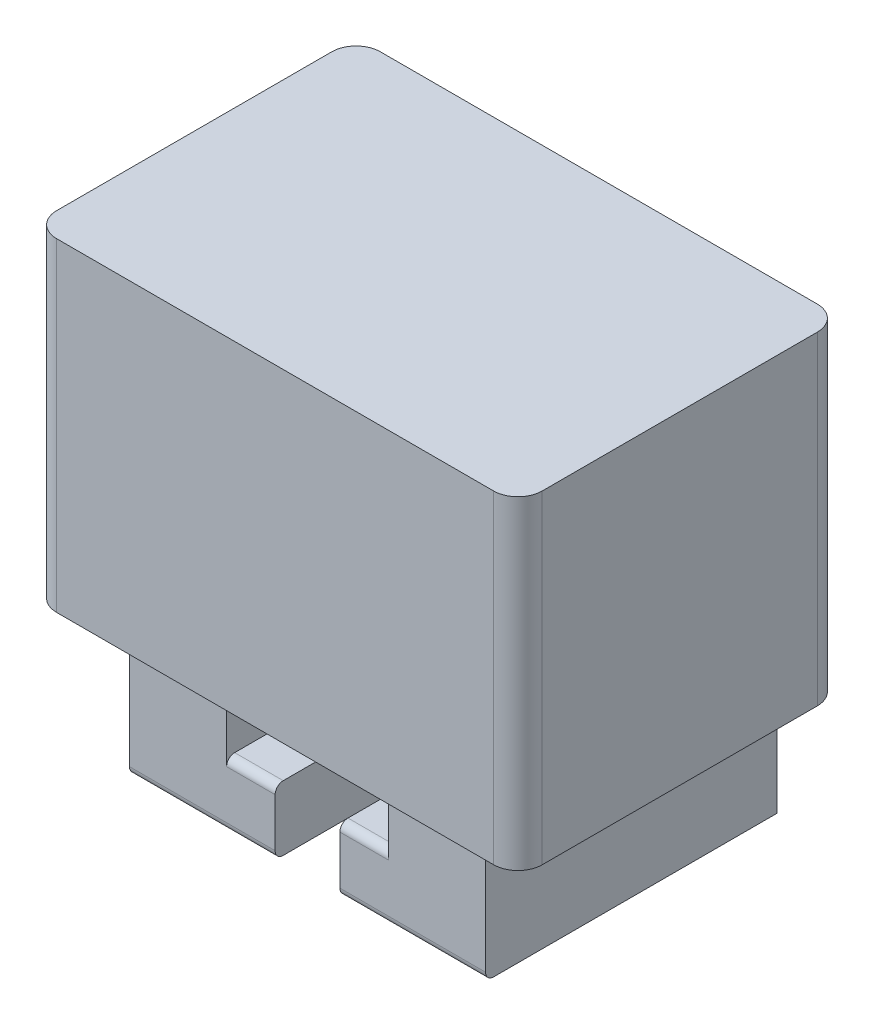
ISO-10303-21;
HEADER;
FILE_DESCRIPTION(('STEP AP214'),'2;1');
FILE_NAME('part.step','',(''),(''),'','','');
FILE_SCHEMA(('AUTOMOTIVE_DESIGN { 1 0 10303 214 1 1 1 1 }'));
ENDSEC;
DATA;
#1=APPLICATION_CONTEXT('core data for automotive mechanical design processes');
#2=APPLICATION_PROTOCOL_DEFINITION('international standard','automotive_design',2000,#1);
#3=PRODUCT_CONTEXT('',#1,'mechanical');
#4=PRODUCT('Part','Part','',(#3));
#5=PRODUCT_RELATED_PRODUCT_CATEGORY('part','',(#4));
#6=PRODUCT_DEFINITION_FORMATION('','',#4);
#7=PRODUCT_DEFINITION_CONTEXT('part definition',#1,'design');
#8=PRODUCT_DEFINITION('design','',#6,#7);
#9=PRODUCT_DEFINITION_SHAPE('','',#8);
#10=(LENGTH_UNIT() NAMED_UNIT(*) SI_UNIT(.MILLI.,.METRE.));
#11=(NAMED_UNIT(*) PLANE_ANGLE_UNIT() SI_UNIT($,.RADIAN.));
#12=(NAMED_UNIT(*) SI_UNIT($,.STERADIAN.) SOLID_ANGLE_UNIT());
#13=UNCERTAINTY_MEASURE_WITH_UNIT(LENGTH_MEASURE(1.E-05),#10,'distance_accuracy_value','');
#14=(GEOMETRIC_REPRESENTATION_CONTEXT(3) GLOBAL_UNCERTAINTY_ASSIGNED_CONTEXT((#13)) GLOBAL_UNIT_ASSIGNED_CONTEXT((#10,
#11,#12)) REPRESENTATION_CONTEXT('',''));
#15=CARTESIAN_POINT('',(0.,0.,0.));
#16=DIRECTION('',(0.,0.,1.));
#17=DIRECTION('',(1.,0.,0.));
#18=AXIS2_PLACEMENT_3D('',#15,#16,#17);
#19=CARTESIAN_POINT('',(0.,-49.7873456126754,0.));
#20=DIRECTION('',(0.,1.,0.));
#21=DIRECTION('',(0.,0.,1.));
#22=AXIS2_PLACEMENT_3D('',#19,#20,#21);
#23=PLANE('',#22);
#24=DIRECTION('',(-1.,0.,0.));
#25=VECTOR('',#24,1.);
#26=CARTESIAN_POINT('',(5.,-49.7873456126754,-17.5));
#27=LINE('',#26,#25);
#28=CARTESIAN_POINT('',(5.,-49.7873456126754,-17.5));
#29=VERTEX_POINT('',#28);
#30=CARTESIAN_POINT('',(2.,-49.7873456126754,-17.5));
#31=VERTEX_POINT('',#30);
#32=EDGE_CURVE('E502',#29,#31,#27,.T.);
#33=ORIENTED_EDGE('',*,*,#32,.F.);
#34=DIRECTION('',(0.,0.,-1.));
#35=VECTOR('',#34,1.);
#36=CARTESIAN_POINT('',(5.,-49.7873456126754,-2.));
#37=LINE('',#36,#35);
#38=CARTESIAN_POINT('',(5.,-49.7873456126754,-20.));
#39=VERTEX_POINT('',#38);
#40=EDGE_CURVE('E271',#29,#39,#37,.T.);
#41=ORIENTED_EDGE('',*,*,#40,.T.);
#42=DIRECTION('',(1.,0.,0.));
#43=VECTOR('',#42,1.);
#44=CARTESIAN_POINT('',(11.,-49.7873456126754,-20.));
#45=LINE('',#44,#43);
#46=CARTESIAN_POINT('',(2.,-49.7873456126754,-20.));
#47=VERTEX_POINT('',#46);
#48=EDGE_CURVE('E462',#47,#39,#45,.T.);
#49=ORIENTED_EDGE('',*,*,#48,.F.);
#50=DIRECTION('',(0.,0.,-1.));
#51=VECTOR('',#50,1.);
#52=CARTESIAN_POINT('',(2.00000000000001,-49.7873456126754,-2.));
#53=LINE('',#52,#51);
#54=EDGE_CURVE('E469',#31,#47,#53,.T.);
#55=ORIENTED_EDGE('',*,*,#54,.F.);
#56=EDGE_LOOP('',(#33,#41,#49,#55));
#57=FACE_BOUND('',#56,.T.);
#58=ADVANCED_FACE('F43',(#57),#23,.T.);
#59=DIRECTION('',(-1.,0.,0.));
#60=VECTOR('',#59,1.);
#61=CARTESIAN_POINT('',(5.,-49.7873456126754,-16.5));
#62=LINE('',#61,#60);
#63=CARTESIAN_POINT('',(5.,-49.7873456126754,-16.5));
#64=VERTEX_POINT('',#63);
#65=CARTESIAN_POINT('',(2.,-49.7873456126754,-16.5));
#66=VERTEX_POINT('',#65);
#67=EDGE_CURVE('E252',#64,#66,#62,.T.);
#68=ORIENTED_EDGE('',*,*,#67,.T.);
#69=CARTESIAN_POINT('',(2.,-49.7873456126754,-5.5));
#70=VERTEX_POINT('',#69);
#71=EDGE_CURVE('E468',#70,#66,#53,.T.);
#72=ORIENTED_EDGE('',*,*,#71,.F.);
#73=DIRECTION('',(-1.,0.,0.));
#74=VECTOR('',#73,1.);
#75=CARTESIAN_POINT('',(5.,-49.7873456126754,-5.5));
#76=LINE('',#75,#74);
#77=CARTESIAN_POINT('',(5.,-49.7873456126754,-5.5));
#78=VERTEX_POINT('',#77);
#79=EDGE_CURVE('E275',#78,#70,#76,.T.);
#80=ORIENTED_EDGE('',*,*,#79,.F.);
#81=EDGE_CURVE('E269',#78,#64,#37,.T.);
#82=ORIENTED_EDGE('',*,*,#81,.T.);
#83=EDGE_LOOP('',(#68,#72,#80,#82));
#84=FACE_BOUND('',#83,.T.);
#85=ADVANCED_FACE('F274',(#84),#23,.T.);
#86=CARTESIAN_POINT('',(0.,-49.7873456126754,0.));
#87=DIRECTION('',(0.,-1.,0.));
#88=DIRECTION('',(0.,0.,-1.));
#89=AXIS2_PLACEMENT_3D('',#86,#87,#88);
#90=PLANE('',#89);
#91=DIRECTION('',(0.,0.,1.));
#92=VECTOR('',#91,1.);
#93=CARTESIAN_POINT('',(-5.,-49.7873456126754,-2.));
#94=LINE('',#93,#92);
#95=CARTESIAN_POINT('',(-5.,-49.7873456126754,-20.));
#96=VERTEX_POINT('',#95);
#97=CARTESIAN_POINT('',(-5.,-49.7873456126754,-17.5));
#98=VERTEX_POINT('',#97);
#99=EDGE_CURVE('E301',#96,#98,#94,.T.);
#100=ORIENTED_EDGE('',*,*,#99,.T.);
#101=DIRECTION('',(1.,0.,0.));
#102=VECTOR('',#101,1.);
#103=CARTESIAN_POINT('',(-5.,-49.7873456126754,-17.5));
#104=LINE('',#103,#102);
#105=CARTESIAN_POINT('',(-2.,-49.7873456126754,-17.5));
#106=VERTEX_POINT('',#105);
#107=EDGE_CURVE('E485',#98,#106,#104,.T.);
#108=ORIENTED_EDGE('',*,*,#107,.T.);
#109=DIRECTION('',(0.,0.,1.));
#110=VECTOR('',#109,1.);
#111=CARTESIAN_POINT('',(-2.00000000000001,-49.7873456126754,-2.));
#112=LINE('',#111,#110);
#113=CARTESIAN_POINT('',(-2.,-49.7873456126754,-20.));
#114=VERTEX_POINT('',#113);
#115=EDGE_CURVE('E435',#114,#106,#112,.T.);
#116=ORIENTED_EDGE('',*,*,#115,.F.);
#117=DIRECTION('',(1.,0.,0.));
#118=VECTOR('',#117,1.);
#119=CARTESIAN_POINT('',(-11.,-49.7873456126754,-20.));
#120=LINE('',#119,#118);
#121=EDGE_CURVE('E433',#96,#114,#120,.T.);
#122=ORIENTED_EDGE('',*,*,#121,.F.);
#123=EDGE_LOOP('',(#100,#108,#116,#122));
#124=FACE_BOUND('',#123,.T.);
#125=ADVANCED_FACE('F563',(#124),#90,.F.);
#126=CARTESIAN_POINT('',(-2.,-49.7873456126754,-16.5));
#127=VERTEX_POINT('',#126);
#128=CARTESIAN_POINT('',(-2.,-49.7873456126754,-5.5));
#129=VERTEX_POINT('',#128);
#130=EDGE_CURVE('E432',#127,#129,#112,.T.);
#131=ORIENTED_EDGE('',*,*,#130,.F.);
#132=DIRECTION('',(1.,0.,0.));
#133=VECTOR('',#132,1.);
#134=CARTESIAN_POINT('',(-5.,-49.7873456126754,-16.5));
#135=LINE('',#134,#133);
#136=CARTESIAN_POINT('',(-5.,-49.7873456126754,-16.5));
#137=VERTEX_POINT('',#136);
#138=EDGE_CURVE('E484',#137,#127,#135,.T.);
#139=ORIENTED_EDGE('',*,*,#138,.F.);
#140=CARTESIAN_POINT('',(-5.,-49.7873456126754,-5.5));
#141=VERTEX_POINT('',#140);
#142=EDGE_CURVE('E305',#137,#141,#94,.T.);
#143=ORIENTED_EDGE('',*,*,#142,.T.);
#144=DIRECTION('',(1.,0.,0.));
#145=VECTOR('',#144,1.);
#146=CARTESIAN_POINT('',(-5.,-49.7873456126754,-5.5));
#147=LINE('',#146,#145);
#148=EDGE_CURVE('E476',#141,#129,#147,.T.);
#149=ORIENTED_EDGE('',*,*,#148,.T.);
#150=EDGE_LOOP('',(#131,#139,#143,#149));
#151=FACE_BOUND('',#150,.T.);
#152=ADVANCED_FACE('F580',(#151),#90,.F.);
#153=CARTESIAN_POINT('',(-15.,-45.2873456126754,-29.0681841134833));
#154=DIRECTION('',(0.,-1.,0.));
#155=DIRECTION('',(0.,0.,-1.));
#156=AXIS2_PLACEMENT_3D('',#153,#154,#155);
#157=PLANE('',#156);
#158=DIRECTION('',(1.,0.,0.));
#159=VECTOR('',#158,1.);
#160=CARTESIAN_POINT('',(-15.,-45.2873456126754,0.));
#161=LINE('',#160,#159);
#162=CARTESIAN_POINT('',(-13.5,-45.2873456126754,0.));
#163=VERTEX_POINT('',#162);
#164=CARTESIAN_POINT('',(13.5,-45.2873456126754,0.));
#165=VERTEX_POINT('',#164);
#166=EDGE_CURVE('E325',#163,#165,#161,.T.);
#167=ORIENTED_EDGE('',*,*,#166,.F.);
#168=CARTESIAN_POINT('',(-13.5,-45.2873456126754,-1.5));
#169=DIRECTION('',(0.,-1.,0.));
#170=DIRECTION('',(0.,0.,-1.));
#171=AXIS2_PLACEMENT_3D('',#168,#169,#170);
#172=CIRCLE('',#171,1.5);
#173=CARTESIAN_POINT('',(-15.,-45.2873456126754,-1.5));
#174=VERTEX_POINT('',#173);
#175=EDGE_CURVE('E362',#163,#174,#172,.T.);
#176=ORIENTED_EDGE('',*,*,#175,.T.);
#177=DIRECTION('',(0.,0.,1.));
#178=VECTOR('',#177,1.);
#179=CARTESIAN_POINT('',(-15.,-45.2873456126754,-29.0681841134833));
#180=LINE('',#179,#178);
#181=CARTESIAN_POINT('',(-15.,-45.2873456126754,-18.5));
#182=VERTEX_POINT('',#181);
#183=EDGE_CURVE('E331',#182,#174,#180,.T.);
#184=ORIENTED_EDGE('',*,*,#183,.F.);
#185=CARTESIAN_POINT('',(-13.5,-45.2873456126754,-18.5));
#186=DIRECTION('',(0.,-1.,0.));
#187=DIRECTION('',(0.,0.,-1.));
#188=AXIS2_PLACEMENT_3D('',#185,#186,#187);
#189=CIRCLE('',#188,1.5);
#190=CARTESIAN_POINT('',(-13.5,-45.2873456126754,-20.));
#191=VERTEX_POINT('',#190);
#192=EDGE_CURVE('E360',#182,#191,#189,.T.);
#193=ORIENTED_EDGE('',*,*,#192,.T.);
#194=DIRECTION('',(-1.,0.,0.));
#195=VECTOR('',#194,1.);
#196=CARTESIAN_POINT('',(0.,-45.2873456126754,-20.));
#197=LINE('',#196,#195);
#198=CARTESIAN_POINT('',(-11.,-45.2873456126754,-20.));
#199=VERTEX_POINT('',#198);
#200=EDGE_CURVE('E335',#199,#191,#197,.T.);
#201=ORIENTED_EDGE('',*,*,#200,.F.);
#202=DIRECTION('',(0.,0.,-1.));
#203=VECTOR('',#202,1.);
#204=CARTESIAN_POINT('',(-11.,-45.2873456126754,-2.));
#205=LINE('',#204,#203);
#206=CARTESIAN_POINT('',(-11.,-45.2873456126754,-2.));
#207=VERTEX_POINT('',#206);
#208=EDGE_CURVE('E300',#207,#199,#205,.T.);
#209=ORIENTED_EDGE('',*,*,#208,.F.);
#210=DIRECTION('',(-1.,0.,0.));
#211=VECTOR('',#210,1.);
#212=CARTESIAN_POINT('',(-11.,-45.2873456126754,-2.));
#213=LINE('',#212,#211);
#214=CARTESIAN_POINT('',(-5.,-45.2873456126754,-2.));
#215=VERTEX_POINT('',#214);
#216=EDGE_CURVE('E312',#215,#207,#213,.T.);
#217=ORIENTED_EDGE('',*,*,#216,.F.);
#218=DIRECTION('',(0.,0.,1.));
#219=VECTOR('',#218,1.);
#220=CARTESIAN_POINT('',(-5.,-45.2873456126754,-2.));
#221=LINE('',#220,#219);
#222=CARTESIAN_POINT('',(-5.,-45.2873456126754,-20.));
#223=VERTEX_POINT('',#222);
#224=EDGE_CURVE('E309',#223,#215,#221,.T.);
#225=ORIENTED_EDGE('',*,*,#224,.F.);
#226=CARTESIAN_POINT('',(5.,-45.2873456126754,-20.));
#227=VERTEX_POINT('',#226);
#228=EDGE_CURVE('E347',#227,#223,#197,.T.);
#229=ORIENTED_EDGE('',*,*,#228,.F.);
#230=DIRECTION('',(0.,0.,-1.));
#231=VECTOR('',#230,1.);
#232=CARTESIAN_POINT('',(5.,-45.2873456126754,-2.));
#233=LINE('',#232,#231);
#234=CARTESIAN_POINT('',(5.,-45.2873456126754,-2.));
#235=VERTEX_POINT('',#234);
#236=EDGE_CURVE('E279',#235,#227,#233,.T.);
#237=ORIENTED_EDGE('',*,*,#236,.F.);
#238=DIRECTION('',(-1.,0.,0.));
#239=VECTOR('',#238,1.);
#240=CARTESIAN_POINT('',(11.,-45.2873456126754,-2.));
#241=LINE('',#240,#239);
#242=CARTESIAN_POINT('',(11.,-45.2873456126754,-2.));
#243=VERTEX_POINT('',#242);
#244=EDGE_CURVE('E287',#243,#235,#241,.T.);
#245=ORIENTED_EDGE('',*,*,#244,.F.);
#246=DIRECTION('',(0.,0.,1.));
#247=VECTOR('',#246,1.);
#248=CARTESIAN_POINT('',(11.,-45.2873456126754,-2.));
#249=LINE('',#248,#247);
#250=CARTESIAN_POINT('',(11.,-45.2873456126754,-20.));
#251=VERTEX_POINT('',#250);
#252=EDGE_CURVE('E284',#251,#243,#249,.T.);
#253=ORIENTED_EDGE('',*,*,#252,.F.);
#254=CARTESIAN_POINT('',(13.5,-45.2873456126754,-20.));
#255=VERTEX_POINT('',#254);
#256=EDGE_CURVE('E344',#255,#251,#197,.T.);
#257=ORIENTED_EDGE('',*,*,#256,.F.);
#258=CARTESIAN_POINT('',(13.5,-45.2873456126754,-18.5));
#259=DIRECTION('',(0.,-1.,0.));
#260=DIRECTION('',(0.,0.,-1.));
#261=AXIS2_PLACEMENT_3D('',#258,#259,#260);
#262=CIRCLE('',#261,1.5);
#263=CARTESIAN_POINT('',(15.,-45.2873456126754,-18.5));
#264=VERTEX_POINT('',#263);
#265=EDGE_CURVE('E358',#255,#264,#262,.T.);
#266=ORIENTED_EDGE('',*,*,#265,.T.);
#267=DIRECTION('',(0.,0.,1.));
#268=VECTOR('',#267,1.);
#269=CARTESIAN_POINT('',(15.,-45.2873456126754,-29.0681841134833));
#270=LINE('',#269,#268);
#271=CARTESIAN_POINT('',(15.,-45.2873456126754,-1.5));
#272=VERTEX_POINT('',#271);
#273=EDGE_CURVE('E339',#264,#272,#270,.T.);
#274=ORIENTED_EDGE('',*,*,#273,.T.);
#275=CARTESIAN_POINT('',(13.5,-45.2873456126754,-1.5));
#276=DIRECTION('',(0.,-1.,0.));
#277=DIRECTION('',(0.,0.,-1.));
#278=AXIS2_PLACEMENT_3D('',#275,#276,#277);
#279=CIRCLE('',#278,1.5);
#280=EDGE_CURVE('E356',#272,#165,#279,.T.);
#281=ORIENTED_EDGE('',*,*,#280,.T.);
#282=EDGE_LOOP('',(#167,#176,#184,#193,#201,#209,#217,#225,#229,#237,#245,#253,#257,#266,#274,#281));
#283=FACE_BOUND('',#282,.T.);
#284=ADVANCED_FACE('F536',(#283),#157,.T.);
#285=CARTESIAN_POINT('',(15.,-46.3366632208372,-20.));
#286=DIRECTION('',(1.,0.,0.));
#287=DIRECTION('',(0.,1.,0.));
#288=AXIS2_PLACEMENT_3D('',#285,#286,#287);
#289=PLANE('',#288);
#290=ORIENTED_EDGE('',*,*,#273,.F.);
#291=DIRECTION('',(0.,-1.,0.));
#292=VECTOR('',#291,1.);
#293=CARTESIAN_POINT('',(15.,-46.3366632208372,-18.5));
#294=LINE('',#293,#292);
#295=CARTESIAN_POINT('',(15.,-25.2873456126754,-18.5));
#296=VERTEX_POINT('',#295);
#297=EDGE_CURVE('E384',#264,#296,#294,.F.);
#298=ORIENTED_EDGE('',*,*,#297,.T.);
#299=DIRECTION('',(0.,0.,1.));
#300=VECTOR('',#299,1.);
#301=CARTESIAN_POINT('',(15.,-25.2873456126754,-29.0681841134833));
#302=LINE('',#301,#300);
#303=CARTESIAN_POINT('',(15.,-25.2873456126754,-1.5));
#304=VERTEX_POINT('',#303);
#305=EDGE_CURVE('E336',#296,#304,#302,.T.);
#306=ORIENTED_EDGE('',*,*,#305,.T.);
#307=DIRECTION('',(0.,1.,0.));
#308=VECTOR('',#307,1.);
#309=CARTESIAN_POINT('',(15.,-46.3366632208372,-1.5));
#310=LINE('',#309,#308);
#311=EDGE_CURVE('E382',#304,#272,#310,.F.);
#312=ORIENTED_EDGE('',*,*,#311,.T.);
#313=EDGE_LOOP('',(#290,#298,#306,#312));
#314=FACE_BOUND('',#313,.T.);
#315=ADVANCED_FACE('F604',(#314),#289,.T.);
#316=CARTESIAN_POINT('',(-15.,-46.3366632208372,-20.));
#317=DIRECTION('',(-1.,0.,0.));
#318=DIRECTION('',(0.,-1.,0.));
#319=AXIS2_PLACEMENT_3D('',#316,#317,#318);
#320=PLANE('',#319);
#321=ORIENTED_EDGE('',*,*,#183,.T.);
#322=DIRECTION('',(0.,-1.,0.));
#323=VECTOR('',#322,1.);
#324=CARTESIAN_POINT('',(-15.,-46.3366632208372,-1.5));
#325=LINE('',#324,#323);
#326=CARTESIAN_POINT('',(-15.,-25.2873456126754,-1.5));
#327=VERTEX_POINT('',#326);
#328=EDGE_CURVE('E366',#174,#327,#325,.F.);
#329=ORIENTED_EDGE('',*,*,#328,.T.);
#330=DIRECTION('',(0.,0.,1.));
#331=VECTOR('',#330,1.);
#332=CARTESIAN_POINT('',(-15.,-25.2873456126754,-29.0681841134833));
#333=LINE('',#332,#331);
#334=CARTESIAN_POINT('',(-15.,-25.2873456126754,-18.5));
#335=VERTEX_POINT('',#334);
#336=EDGE_CURVE('E332',#335,#327,#333,.T.);
#337=ORIENTED_EDGE('',*,*,#336,.F.);
#338=DIRECTION('',(0.,1.,0.));
#339=VECTOR('',#338,1.);
#340=CARTESIAN_POINT('',(-15.,-46.3366632208372,-18.5));
#341=LINE('',#340,#339);
#342=EDGE_CURVE('E364',#335,#182,#341,.F.);
#343=ORIENTED_EDGE('',*,*,#342,.T.);
#344=EDGE_LOOP('',(#321,#329,#337,#343));
#345=FACE_BOUND('',#344,.T.);
#346=ADVANCED_FACE('F607',(#345),#320,.T.);
#347=CARTESIAN_POINT('',(0.,30.,-20.));
#348=DIRECTION('',(0.,0.,-1.));
#349=DIRECTION('',(-1.,0.,0.));
#350=AXIS2_PLACEMENT_3D('',#347,#348,#349);
#351=PLANE('',#350);
#352=ORIENTED_EDGE('',*,*,#200,.T.);
#353=DIRECTION('',(0.,1.,0.));
#354=VECTOR('',#353,1.);
#355=CARTESIAN_POINT('',(-13.5,30.,-20.));
#356=LINE('',#355,#354);
#357=CARTESIAN_POINT('',(-13.5,-25.2873456126754,-20.));
#358=VERTEX_POINT('',#357);
#359=EDGE_CURVE('E379',#191,#358,#356,.T.);
#360=ORIENTED_EDGE('',*,*,#359,.T.);
#361=DIRECTION('',(1.,0.,0.));
#362=VECTOR('',#361,1.);
#363=CARTESIAN_POINT('',(0.,-25.2873456126754,-20.));
#364=LINE('',#363,#362);
#365=CARTESIAN_POINT('',(13.5,-25.2873456126754,-20.));
#366=VERTEX_POINT('',#365);
#367=EDGE_CURVE('E346',#358,#366,#364,.T.);
#368=ORIENTED_EDGE('',*,*,#367,.T.);
#369=DIRECTION('',(0.,-1.,0.));
#370=VECTOR('',#369,1.);
#371=CARTESIAN_POINT('',(13.5,30.,-20.));
#372=LINE('',#371,#370);
#373=EDGE_CURVE('E376',#366,#255,#372,.T.);
#374=ORIENTED_EDGE('',*,*,#373,.T.);
#375=ORIENTED_EDGE('',*,*,#256,.T.);
#376=DIRECTION('',(0.,1.,0.));
#377=VECTOR('',#376,1.);
#378=CARTESIAN_POINT('',(11.,-49.7873456126754,-20.));
#379=LINE('',#378,#377);
#380=CARTESIAN_POINT('',(11.,-53.7873456126754,-20.));
#381=VERTEX_POINT('',#380);
#382=EDGE_CURVE('E278',#381,#251,#379,.T.);
#383=ORIENTED_EDGE('',*,*,#382,.F.);
#384=DIRECTION('',(1.,0.,0.));
#385=VECTOR('',#384,1.);
#386=CARTESIAN_POINT('',(11.,-53.7873456126754,-20.));
#387=LINE('',#386,#385);
#388=CARTESIAN_POINT('',(2.,-53.7873456126754,-20.));
#389=VERTEX_POINT('',#388);
#390=EDGE_CURVE('E461',#389,#381,#387,.T.);
#391=ORIENTED_EDGE('',*,*,#390,.F.);
#392=DIRECTION('',(0.,1.,0.));
#393=VECTOR('',#392,1.);
#394=CARTESIAN_POINT('',(2.,-53.7873456126754,-20.));
#395=LINE('',#394,#393);
#396=EDGE_CURVE('E458',#389,#47,#395,.T.);
#397=ORIENTED_EDGE('',*,*,#396,.T.);
#398=ORIENTED_EDGE('',*,*,#48,.T.);
#399=DIRECTION('',(0.,1.,0.));
#400=VECTOR('',#399,1.);
#401=CARTESIAN_POINT('',(5.,-49.7873456126754,-20.));
#402=LINE('',#401,#400);
#403=EDGE_CURVE('E293',#39,#227,#402,.T.);
#404=ORIENTED_EDGE('',*,*,#403,.T.);
#405=ORIENTED_EDGE('',*,*,#228,.T.);
#406=DIRECTION('',(0.,1.,0.));
#407=VECTOR('',#406,1.);
#408=CARTESIAN_POINT('',(-5.,-49.7873456126754,-20.));
#409=LINE('',#408,#407);
#410=EDGE_CURVE('E319',#96,#223,#409,.T.);
#411=ORIENTED_EDGE('',*,*,#410,.F.);
#412=ORIENTED_EDGE('',*,*,#121,.T.);
#413=DIRECTION('',(0.,1.,0.));
#414=VECTOR('',#413,1.);
#415=CARTESIAN_POINT('',(-2.,-53.7873456126754,-20.));
#416=LINE('',#415,#414);
#417=CARTESIAN_POINT('',(-2.,-53.7873456126754,-20.));
#418=VERTEX_POINT('',#417);
#419=EDGE_CURVE('E282',#418,#114,#416,.T.);
#420=ORIENTED_EDGE('',*,*,#419,.F.);
#421=DIRECTION('',(1.,0.,0.));
#422=VECTOR('',#421,1.);
#423=CARTESIAN_POINT('',(-11.,-53.7873456126754,-20.));
#424=LINE('',#423,#422);
#425=CARTESIAN_POINT('',(-11.,-53.7873456126754,-20.));
#426=VERTEX_POINT('',#425);
#427=EDGE_CURVE('E447',#426,#418,#424,.T.);
#428=ORIENTED_EDGE('',*,*,#427,.F.);
#429=DIRECTION('',(0.,1.,0.));
#430=VECTOR('',#429,1.);
#431=CARTESIAN_POINT('',(-11.,-49.7873456126754,-20.));
#432=LINE('',#431,#430);
#433=EDGE_CURVE('E322',#426,#199,#432,.T.);
#434=ORIENTED_EDGE('',*,*,#433,.T.);
#435=EDGE_LOOP('',(#352,#360,#368,#374,#375,#383,#391,#397,#398,#404,#405,#411,#412,#420,#428,#434));
#436=FACE_BOUND('',#435,.T.);
#437=ADVANCED_FACE('F514',(#436),#351,.T.);
#438=CARTESIAN_POINT('',(0.,0.,0.));
#439=DIRECTION('',(0.,0.,1.));
#440=DIRECTION('',(1.,0.,0.));
#441=AXIS2_PLACEMENT_3D('',#438,#439,#440);
#442=PLANE('',#441);
#443=DIRECTION('',(-1.,0.,0.));
#444=VECTOR('',#443,1.);
#445=CARTESIAN_POINT('',(-15.,-25.2873456126754,0.));
#446=LINE('',#445,#444);
#447=CARTESIAN_POINT('',(13.5,-25.2873456126754,0.));
#448=VERTEX_POINT('',#447);
#449=CARTESIAN_POINT('',(-13.5,-25.2873456126754,0.));
#450=VERTEX_POINT('',#449);
#451=EDGE_CURVE('E328',#448,#450,#446,.T.);
#452=ORIENTED_EDGE('',*,*,#451,.T.);
#453=DIRECTION('',(0.,-1.,0.));
#454=VECTOR('',#453,1.);
#455=CARTESIAN_POINT('',(-13.5,0.,0.));
#456=LINE('',#455,#454);
#457=EDGE_CURVE('E353',#450,#163,#456,.T.);
#458=ORIENTED_EDGE('',*,*,#457,.T.);
#459=ORIENTED_EDGE('',*,*,#166,.T.);
#460=DIRECTION('',(0.,1.,0.));
#461=VECTOR('',#460,1.);
#462=CARTESIAN_POINT('',(13.5,0.,0.));
#463=LINE('',#462,#461);
#464=EDGE_CURVE('E350',#165,#448,#463,.T.);
#465=ORIENTED_EDGE('',*,*,#464,.T.);
#466=EDGE_LOOP('',(#452,#458,#459,#465));
#467=FACE_BOUND('',#466,.T.);
#468=ADVANCED_FACE('F600',(#467),#442,.T.);
#469=CARTESIAN_POINT('',(-15.,-25.2873456126754,-29.0681841134833));
#470=DIRECTION('',(0.,1.,0.));
#471=DIRECTION('',(0.,0.,1.));
#472=AXIS2_PLACEMENT_3D('',#469,#470,#471);
#473=PLANE('',#472);
#474=ORIENTED_EDGE('',*,*,#336,.T.);
#475=CARTESIAN_POINT('',(-13.5,-25.2873456126754,-1.5));
#476=DIRECTION('',(0.,1.,0.));
#477=DIRECTION('',(0.,0.,1.));
#478=AXIS2_PLACEMENT_3D('',#475,#476,#477);
#479=CIRCLE('',#478,1.5);
#480=EDGE_CURVE('E374',#327,#450,#479,.T.);
#481=ORIENTED_EDGE('',*,*,#480,.T.);
#482=ORIENTED_EDGE('',*,*,#451,.F.);
#483=CARTESIAN_POINT('',(13.5,-25.2873456126754,-1.5));
#484=DIRECTION('',(0.,1.,0.));
#485=DIRECTION('',(0.,0.,1.));
#486=AXIS2_PLACEMENT_3D('',#483,#484,#485);
#487=CIRCLE('',#486,1.5);
#488=EDGE_CURVE('E368',#448,#304,#487,.T.);
#489=ORIENTED_EDGE('',*,*,#488,.T.);
#490=ORIENTED_EDGE('',*,*,#305,.F.);
#491=CARTESIAN_POINT('',(13.5,-25.2873456126754,-18.5));
#492=DIRECTION('',(0.,1.,0.));
#493=DIRECTION('',(0.,0.,1.));
#494=AXIS2_PLACEMENT_3D('',#491,#492,#493);
#495=CIRCLE('',#494,1.5);
#496=EDGE_CURVE('E370',#296,#366,#495,.T.);
#497=ORIENTED_EDGE('',*,*,#496,.T.);
#498=ORIENTED_EDGE('',*,*,#367,.F.);
#499=CARTESIAN_POINT('',(-13.5,-25.2873456126754,-18.5));
#500=DIRECTION('',(0.,1.,0.));
#501=DIRECTION('',(0.,0.,1.));
#502=AXIS2_PLACEMENT_3D('',#499,#500,#501);
#503=CIRCLE('',#502,1.5);
#504=EDGE_CURVE('E372',#358,#335,#503,.T.);
#505=ORIENTED_EDGE('',*,*,#504,.T.);
#506=EDGE_LOOP('',(#474,#481,#482,#489,#490,#497,#498,#505));
#507=FACE_BOUND('',#506,.T.);
#508=ADVANCED_FACE('F596',(#507),#473,.T.);
#509=CARTESIAN_POINT('',(-11.,-49.7873456126754,-2.));
#510=DIRECTION('',(1.,0.,0.));
#511=DIRECTION('',(0.,0.,-1.));
#512=AXIS2_PLACEMENT_3D('',#509,#510,#511);
#513=PLANE('',#512);
#514=DIRECTION('',(0.,0.,-1.));
#515=VECTOR('',#514,1.);
#516=CARTESIAN_POINT('',(-11.,-53.7873456126754,-2.));
#517=LINE('',#516,#515);
#518=CARTESIAN_POINT('',(-11.,-53.7873456126754,-2.5));
#519=VERTEX_POINT('',#518);
#520=EDGE_CURVE('E451',#519,#426,#517,.T.);
#521=ORIENTED_EDGE('',*,*,#520,.F.);
#522=CARTESIAN_POINT('',(-11.,-53.2873456126754,-2.5));
#523=DIRECTION('',(1.,0.,0.));
#524=DIRECTION('',(0.,0.,-1.));
#525=AXIS2_PLACEMENT_3D('',#522,#523,#524);
#526=CIRCLE('',#525,0.5);
#527=CARTESIAN_POINT('',(-11.,-53.2873456126754,-2.));
#528=VERTEX_POINT('',#527);
#529=EDGE_CURVE('E403',#519,#528,#526,.F.);
#530=ORIENTED_EDGE('',*,*,#529,.T.);
#531=DIRECTION('',(0.,1.,0.));
#532=VECTOR('',#531,1.);
#533=CARTESIAN_POINT('',(-11.,-49.7873456126754,-2.));
#534=LINE('',#533,#532);
#535=EDGE_CURVE('E304',#528,#207,#534,.T.);
#536=ORIENTED_EDGE('',*,*,#535,.T.);
#537=ORIENTED_EDGE('',*,*,#208,.T.);
#538=ORIENTED_EDGE('',*,*,#433,.F.);
#539=EDGE_LOOP('',(#521,#530,#536,#537,#538));
#540=FACE_BOUND('',#539,.T.);
#541=ADVANCED_FACE('F593',(#540),#513,.F.);
#542=CARTESIAN_POINT('',(-5.,-49.7873456126754,-2.));
#543=DIRECTION('',(-1.,0.,0.));
#544=DIRECTION('',(0.,0.,1.));
#545=AXIS2_PLACEMENT_3D('',#542,#543,#544);
#546=PLANE('',#545);
#547=ORIENTED_EDGE('',*,*,#142,.F.);
#548=CARTESIAN_POINT('',(-5.,-49.7873456126754,-17.));
#549=DIRECTION('',(1.,0.,0.));
#550=DIRECTION('',(0.,0.,-1.));
#551=AXIS2_PLACEMENT_3D('',#548,#549,#550);
#552=CIRCLE('',#551,0.5);
#553=EDGE_CURVE('E489',#98,#137,#552,.T.);
#554=ORIENTED_EDGE('',*,*,#553,.F.);
#555=ORIENTED_EDGE('',*,*,#99,.F.);
#556=ORIENTED_EDGE('',*,*,#410,.T.);
#557=ORIENTED_EDGE('',*,*,#224,.T.);
#558=DIRECTION('',(0.,1.,0.));
#559=VECTOR('',#558,1.);
#560=CARTESIAN_POINT('',(-5.,-49.7873456126754,-2.));
#561=LINE('',#560,#559);
#562=CARTESIAN_POINT('',(-5.,-50.2873456126754,-2.));
#563=VERTEX_POINT('',#562);
#564=EDGE_CURVE('E316',#563,#215,#561,.T.);
#565=ORIENTED_EDGE('',*,*,#564,.F.);
#566=CARTESIAN_POINT('',(-5.,-50.2873456126754,-2.5));
#567=DIRECTION('',(-1.,0.,0.));
#568=DIRECTION('',(0.,0.,1.));
#569=AXIS2_PLACEMENT_3D('',#566,#567,#568);
#570=CIRCLE('',#569,0.5);
#571=CARTESIAN_POINT('',(-5.,-49.7873456126754,-2.5));
#572=VERTEX_POINT('',#571);
#573=EDGE_CURVE('E51',#563,#572,#570,.T.);
#574=ORIENTED_EDGE('',*,*,#573,.T.);
#575=CARTESIAN_POINT('',(-5.,-49.7873456126754,-4.5));
#576=VERTEX_POINT('',#575);
#577=EDGE_CURVE('E306',#576,#572,#94,.T.);
#578=ORIENTED_EDGE('',*,*,#577,.F.);
#579=CARTESIAN_POINT('',(-5.,-49.7873456126754,-5.));
#580=DIRECTION('',(1.,0.,0.));
#581=DIRECTION('',(0.,0.,-1.));
#582=AXIS2_PLACEMENT_3D('',#579,#580,#581);
#583=CIRCLE('',#582,0.5);
#584=EDGE_CURVE('E479',#141,#576,#583,.T.);
#585=ORIENTED_EDGE('',*,*,#584,.F.);
#586=EDGE_LOOP('',(#547,#554,#555,#556,#557,#565,#574,#578,#585));
#587=FACE_BOUND('',#586,.T.);
#588=ADVANCED_FACE('F590',(#587),#546,.F.);
#589=CARTESIAN_POINT('',(-11.,-49.7873456126754,-2.));
#590=DIRECTION('',(0.,0.,-1.));
#591=DIRECTION('',(-1.,0.,0.));
#592=AXIS2_PLACEMENT_3D('',#589,#590,#591);
#593=PLANE('',#592);
#594=ORIENTED_EDGE('',*,*,#535,.F.);
#595=DIRECTION('',(-1.,0.,0.));
#596=VECTOR('',#595,1.);
#597=CARTESIAN_POINT('',(-2.00000000000001,-53.2873456126754,-2.));
#598=LINE('',#597,#596);
#599=CARTESIAN_POINT('',(-2.00000000000001,-53.2873456126754,-2.));
#600=VERTEX_POINT('',#599);
#601=EDGE_CURVE('E408',#528,#600,#598,.F.);
#602=ORIENTED_EDGE('',*,*,#601,.T.);
#603=DIRECTION('',(0.,1.,0.));
#604=VECTOR('',#603,1.);
#605=CARTESIAN_POINT('',(-2.00000000000001,-53.7873456126754,-2.));
#606=LINE('',#605,#604);
#607=CARTESIAN_POINT('',(-2.00000000000001,-50.2873456126754,-2.));
#608=VERTEX_POINT('',#607);
#609=EDGE_CURVE('E441',#600,#608,#606,.T.);
#610=ORIENTED_EDGE('',*,*,#609,.T.);
#611=DIRECTION('',(-1.,0.,0.));
#612=VECTOR('',#611,1.);
#613=CARTESIAN_POINT('',(-11.,-50.2873456126754,-2.));
#614=LINE('',#613,#612);
#615=EDGE_CURVE('E405',#608,#563,#614,.T.);
#616=ORIENTED_EDGE('',*,*,#615,.T.);
#617=ORIENTED_EDGE('',*,*,#564,.T.);
#618=ORIENTED_EDGE('',*,*,#216,.T.);
#619=EDGE_LOOP('',(#594,#602,#610,#616,#617,#618));
#620=FACE_BOUND('',#619,.T.);
#621=ADVANCED_FACE('F440',(#620),#593,.F.);
#622=CARTESIAN_POINT('',(11.,-49.7873456126754,-2.));
#623=DIRECTION('',(-1.,0.,0.));
#624=DIRECTION('',(0.,0.,1.));
#625=AXIS2_PLACEMENT_3D('',#622,#623,#624);
#626=PLANE('',#625);
#627=DIRECTION('',(0.,1.,0.));
#628=VECTOR('',#627,1.);
#629=CARTESIAN_POINT('',(11.,-49.7873456126754,-2.));
#630=LINE('',#629,#628);
#631=CARTESIAN_POINT('',(11.,-53.2873456126754,-2.));
#632=VERTEX_POINT('',#631);
#633=EDGE_CURVE('E298',#632,#243,#630,.T.);
#634=ORIENTED_EDGE('',*,*,#633,.F.);
#635=CARTESIAN_POINT('',(11.,-53.2873456126754,-2.5));
#636=DIRECTION('',(-1.,0.,0.));
#637=DIRECTION('',(0.,0.,1.));
#638=AXIS2_PLACEMENT_3D('',#635,#636,#637);
#639=CIRCLE('',#638,0.5);
#640=CARTESIAN_POINT('',(11.,-53.7873456126754,-2.5));
#641=VERTEX_POINT('',#640);
#642=EDGE_CURVE('E398',#632,#641,#639,.F.);
#643=ORIENTED_EDGE('',*,*,#642,.T.);
#644=DIRECTION('',(0.,0.,1.));
#645=VECTOR('',#644,1.);
#646=CARTESIAN_POINT('',(11.,-53.7873456126754,-2.));
#647=LINE('',#646,#645);
#648=EDGE_CURVE('E465',#381,#641,#647,.T.);
#649=ORIENTED_EDGE('',*,*,#648,.F.);
#650=ORIENTED_EDGE('',*,*,#382,.T.);
#651=ORIENTED_EDGE('',*,*,#252,.T.);
#652=EDGE_LOOP('',(#634,#643,#649,#650,#651));
#653=FACE_BOUND('',#652,.T.);
#654=ADVANCED_FACE('F529',(#653),#626,.F.);
#655=CARTESIAN_POINT('',(11.,-49.7873456126754,-2.));
#656=DIRECTION('',(0.,0.,-1.));
#657=DIRECTION('',(-1.,0.,0.));
#658=AXIS2_PLACEMENT_3D('',#655,#656,#657);
#659=PLANE('',#658);
#660=DIRECTION('',(0.,1.,0.));
#661=VECTOR('',#660,1.);
#662=CARTESIAN_POINT('',(2.00000000000001,-53.7873456126754,-2.));
#663=LINE('',#662,#661);
#664=CARTESIAN_POINT('',(2.00000000000001,-53.2873456126754,-2.));
#665=VERTEX_POINT('',#664);
#666=CARTESIAN_POINT('',(2.00000000000001,-50.2873456126754,-2.));
#667=VERTEX_POINT('',#666);
#668=EDGE_CURVE('E452',#665,#667,#663,.T.);
#669=ORIENTED_EDGE('',*,*,#668,.F.);
#670=DIRECTION('',(-1.,0.,0.));
#671=VECTOR('',#670,1.);
#672=CARTESIAN_POINT('',(11.,-53.2873456126754,-2.));
#673=LINE('',#672,#671);
#674=EDGE_CURVE('E396',#665,#632,#673,.F.);
#675=ORIENTED_EDGE('',*,*,#674,.T.);
#676=ORIENTED_EDGE('',*,*,#633,.T.);
#677=ORIENTED_EDGE('',*,*,#244,.T.);
#678=DIRECTION('',(0.,1.,0.));
#679=VECTOR('',#678,1.);
#680=CARTESIAN_POINT('',(5.,-49.7873456126754,-2.));
#681=LINE('',#680,#679);
#682=CARTESIAN_POINT('',(5.,-50.2873456126754,-2.));
#683=VERTEX_POINT('',#682);
#684=EDGE_CURVE('E295',#683,#235,#681,.T.);
#685=ORIENTED_EDGE('',*,*,#684,.F.);
#686=DIRECTION('',(-1.,0.,0.));
#687=VECTOR('',#686,1.);
#688=CARTESIAN_POINT('',(2.00000000000001,-50.2873456126754,-2.));
#689=LINE('',#688,#687);
#690=EDGE_CURVE('E393',#683,#667,#689,.T.);
#691=ORIENTED_EDGE('',*,*,#690,.T.);
#692=EDGE_LOOP('',(#669,#675,#676,#677,#685,#691));
#693=FACE_BOUND('',#692,.T.);
#694=ADVANCED_FACE('F527',(#693),#659,.F.);
#695=CARTESIAN_POINT('',(5.,-49.7873456126754,-2.));
#696=DIRECTION('',(1.,0.,0.));
#697=DIRECTION('',(0.,0.,-1.));
#698=AXIS2_PLACEMENT_3D('',#695,#696,#697);
#699=PLANE('',#698);
#700=ORIENTED_EDGE('',*,*,#40,.F.);
#701=CARTESIAN_POINT('',(5.,-49.7873456126754,-17.));
#702=DIRECTION('',(1.,0.,0.));
#703=DIRECTION('',(0.,0.,-1.));
#704=AXIS2_PLACEMENT_3D('',#701,#702,#703);
#705=CIRCLE('',#704,0.5);
#706=EDGE_CURVE('E255',#64,#29,#705,.F.);
#707=ORIENTED_EDGE('',*,*,#706,.F.);
#708=ORIENTED_EDGE('',*,*,#81,.F.);
#709=CARTESIAN_POINT('',(5.,-49.7873456126754,-5.));
#710=DIRECTION('',(1.,0.,0.));
#711=DIRECTION('',(0.,0.,-1.));
#712=AXIS2_PLACEMENT_3D('',#709,#710,#711);
#713=CIRCLE('',#712,0.5);
#714=CARTESIAN_POINT('',(5.,-49.7873456126754,-4.5));
#715=VERTEX_POINT('',#714);
#716=EDGE_CURVE('E498',#715,#78,#713,.F.);
#717=ORIENTED_EDGE('',*,*,#716,.F.);
#718=CARTESIAN_POINT('',(5.,-49.7873456126754,-2.5));
#719=VERTEX_POINT('',#718);
#720=EDGE_CURVE('E276',#719,#715,#37,.T.);
#721=ORIENTED_EDGE('',*,*,#720,.F.);
#722=CARTESIAN_POINT('',(5.,-50.2873456126754,-2.5));
#723=DIRECTION('',(1.,0.,0.));
#724=DIRECTION('',(0.,0.,-1.));
#725=AXIS2_PLACEMENT_3D('',#722,#723,#724);
#726=CIRCLE('',#725,0.5);
#727=EDGE_CURVE('E12',#719,#683,#726,.T.);
#728=ORIENTED_EDGE('',*,*,#727,.T.);
#729=ORIENTED_EDGE('',*,*,#684,.T.);
#730=ORIENTED_EDGE('',*,*,#236,.T.);
#731=ORIENTED_EDGE('',*,*,#403,.F.);
#732=EDGE_LOOP('',(#700,#707,#708,#717,#721,#728,#729,#730,#731));
#733=FACE_BOUND('',#732,.T.);
#734=ADVANCED_FACE('F267',(#733),#699,.F.);
#735=ORIENTED_EDGE('',*,*,#577,.T.);
#736=DIRECTION('',(-1.,0.,0.));
#737=VECTOR('',#736,1.);
#738=CARTESIAN_POINT('',(0.,-49.7873456126754,-2.5));
#739=LINE('',#738,#737);
#740=CARTESIAN_POINT('',(-2.00000000000001,-49.7873456126754,-2.5));
#741=VERTEX_POINT('',#740);
#742=EDGE_CURVE('E414',#572,#741,#739,.F.);
#743=ORIENTED_EDGE('',*,*,#742,.T.);
#744=CARTESIAN_POINT('',(-2.,-49.7873456126754,-4.5));
#745=VERTEX_POINT('',#744);
#746=EDGE_CURVE('E422',#745,#741,#112,.T.);
#747=ORIENTED_EDGE('',*,*,#746,.F.);
#748=DIRECTION('',(1.,0.,0.));
#749=VECTOR('',#748,1.);
#750=CARTESIAN_POINT('',(-5.,-49.7873456126754,-4.5));
#751=LINE('',#750,#749);
#752=EDGE_CURVE('E480',#576,#745,#751,.T.);
#753=ORIENTED_EDGE('',*,*,#752,.F.);
#754=EDGE_LOOP('',(#735,#743,#747,#753));
#755=FACE_BOUND('',#754,.T.);
#756=ADVANCED_FACE('F420',(#755),#90,.F.);
#757=CARTESIAN_POINT('',(-2.00000000000001,-53.7873456126754,-2.));
#758=DIRECTION('',(-1.,0.,0.));
#759=DIRECTION('',(0.,0.,1.));
#760=AXIS2_PLACEMENT_3D('',#757,#758,#759);
#761=PLANE('',#760);
#762=ORIENTED_EDGE('',*,*,#609,.F.);
#763=CARTESIAN_POINT('',(-2.00000000000001,-53.2873456126754,-2.5));
#764=DIRECTION('',(-1.,0.,0.));
#765=DIRECTION('',(0.,0.,1.));
#766=AXIS2_PLACEMENT_3D('',#763,#764,#765);
#767=CIRCLE('',#766,0.5);
#768=CARTESIAN_POINT('',(-2.00000000000001,-53.7873456126754,-2.5));
#769=VERTEX_POINT('',#768);
#770=EDGE_CURVE('E412',#600,#769,#767,.F.);
#771=ORIENTED_EDGE('',*,*,#770,.T.);
#772=DIRECTION('',(0.,0.,1.));
#773=VECTOR('',#772,1.);
#774=CARTESIAN_POINT('',(-2.00000000000001,-53.7873456126754,-2.));
#775=LINE('',#774,#773);
#776=EDGE_CURVE('E444',#418,#769,#775,.T.);
#777=ORIENTED_EDGE('',*,*,#776,.F.);
#778=ORIENTED_EDGE('',*,*,#419,.T.);
#779=ORIENTED_EDGE('',*,*,#115,.T.);
#780=CARTESIAN_POINT('',(-2.,-49.7873456126754,-17.));
#781=DIRECTION('',(1.,0.,0.));
#782=DIRECTION('',(0.,0.,-1.));
#783=AXIS2_PLACEMENT_3D('',#780,#781,#782);
#784=CIRCLE('',#783,0.5);
#785=EDGE_CURVE('E488',#106,#127,#784,.T.);
#786=ORIENTED_EDGE('',*,*,#785,.T.);
#787=ORIENTED_EDGE('',*,*,#130,.T.);
#788=CARTESIAN_POINT('',(-2.,-49.7873456126754,-5.));
#789=DIRECTION('',(1.,0.,0.));
#790=DIRECTION('',(0.,0.,-1.));
#791=AXIS2_PLACEMENT_3D('',#788,#789,#790);
#792=CIRCLE('',#791,0.5);
#793=EDGE_CURVE('E431',#129,#745,#792,.T.);
#794=ORIENTED_EDGE('',*,*,#793,.T.);
#795=ORIENTED_EDGE('',*,*,#746,.T.);
#796=CARTESIAN_POINT('',(-2.00000000000001,-50.2873456126754,-2.5));
#797=DIRECTION('',(-1.,0.,0.));
#798=DIRECTION('',(0.,0.,1.));
#799=AXIS2_PLACEMENT_3D('',#796,#797,#798);
#800=CIRCLE('',#799,0.5);
#801=EDGE_CURVE('E410',#741,#608,#800,.F.);
#802=ORIENTED_EDGE('',*,*,#801,.T.);
#803=EDGE_LOOP('',(#762,#771,#777,#778,#779,#786,#787,#794,#795,#802));
#804=FACE_BOUND('',#803,.T.);
#805=ADVANCED_FACE('F428',(#804),#761,.F.);
#806=CARTESIAN_POINT('',(0.,-53.7873456126754,0.));
#807=DIRECTION('',(0.,-1.,0.));
#808=DIRECTION('',(0.,0.,-1.));
#809=AXIS2_PLACEMENT_3D('',#806,#807,#808);
#810=PLANE('',#809);
#811=ORIENTED_EDGE('',*,*,#776,.T.);
#812=DIRECTION('',(-1.,0.,0.));
#813=VECTOR('',#812,1.);
#814=CARTESIAN_POINT('',(-11.,-53.7873456126754,-2.5));
#815=LINE('',#814,#813);
#816=EDGE_CURVE('E400',#769,#519,#815,.T.);
#817=ORIENTED_EDGE('',*,*,#816,.T.);
#818=ORIENTED_EDGE('',*,*,#520,.T.);
#819=ORIENTED_EDGE('',*,*,#427,.T.);
#820=EDGE_LOOP('',(#811,#817,#818,#819));
#821=FACE_BOUND('',#820,.T.);
#822=ADVANCED_FACE('F567',(#821),#810,.T.);
#823=CARTESIAN_POINT('',(2.00000000000001,-49.7873456126754,-2.5));
#824=VERTEX_POINT('',#823);
#825=CARTESIAN_POINT('',(2.,-49.7873456126754,-4.5));
#826=VERTEX_POINT('',#825);
#827=EDGE_CURVE('E466',#824,#826,#53,.T.);
#828=ORIENTED_EDGE('',*,*,#827,.F.);
#829=DIRECTION('',(-1.,0.,0.));
#830=VECTOR('',#829,1.);
#831=CARTESIAN_POINT('',(5.,-49.7873456126754,-2.5));
#832=LINE('',#831,#830);
#833=EDGE_CURVE('E58',#824,#719,#832,.F.);
#834=ORIENTED_EDGE('',*,*,#833,.T.);
#835=ORIENTED_EDGE('',*,*,#720,.T.);
#836=DIRECTION('',(-1.,0.,0.));
#837=VECTOR('',#836,1.);
#838=CARTESIAN_POINT('',(5.,-49.7873456126754,-4.5));
#839=LINE('',#838,#837);
#840=EDGE_CURVE('E494',#715,#826,#839,.T.);
#841=ORIENTED_EDGE('',*,*,#840,.T.);
#842=EDGE_LOOP('',(#828,#834,#835,#841));
#843=FACE_BOUND('',#842,.T.);
#844=ADVANCED_FACE('F542',(#843),#23,.T.);
#845=CARTESIAN_POINT('',(2.00000000000001,-53.7873456126754,-2.));
#846=DIRECTION('',(1.,0.,0.));
#847=DIRECTION('',(0.,0.,-1.));
#848=AXIS2_PLACEMENT_3D('',#845,#846,#847);
#849=PLANE('',#848);
#850=DIRECTION('',(0.,0.,-1.));
#851=VECTOR('',#850,1.);
#852=CARTESIAN_POINT('',(2.00000000000001,-53.7873456126754,-2.));
#853=LINE('',#852,#851);
#854=CARTESIAN_POINT('',(2.00000000000001,-53.7873456126754,-2.5));
#855=VERTEX_POINT('',#854);
#856=EDGE_CURVE('E472',#855,#389,#853,.T.);
#857=ORIENTED_EDGE('',*,*,#856,.F.);
#858=CARTESIAN_POINT('',(2.00000000000001,-53.2873456126754,-2.5));
#859=DIRECTION('',(1.,0.,0.));
#860=DIRECTION('',(0.,0.,-1.));
#861=AXIS2_PLACEMENT_3D('',#858,#859,#860);
#862=CIRCLE('',#861,0.5);
#863=EDGE_CURVE('E391',#855,#665,#862,.F.);
#864=ORIENTED_EDGE('',*,*,#863,.T.);
#865=ORIENTED_EDGE('',*,*,#668,.T.);
#866=CARTESIAN_POINT('',(2.00000000000001,-50.2873456126754,-2.5));
#867=DIRECTION('',(1.,0.,0.));
#868=DIRECTION('',(0.,0.,-1.));
#869=AXIS2_PLACEMENT_3D('',#866,#867,#868);
#870=CIRCLE('',#869,0.5);
#871=EDGE_CURVE('E389',#667,#824,#870,.F.);
#872=ORIENTED_EDGE('',*,*,#871,.T.);
#873=ORIENTED_EDGE('',*,*,#827,.T.);
#874=CARTESIAN_POINT('',(2.,-49.7873456126754,-5.));
#875=DIRECTION('',(1.,0.,0.));
#876=DIRECTION('',(0.,0.,-1.));
#877=AXIS2_PLACEMENT_3D('',#874,#875,#876);
#878=CIRCLE('',#877,0.5);
#879=EDGE_CURVE('E497',#826,#70,#878,.F.);
#880=ORIENTED_EDGE('',*,*,#879,.T.);
#881=ORIENTED_EDGE('',*,*,#71,.T.);
#882=CARTESIAN_POINT('',(2.,-49.7873456126754,-17.));
#883=DIRECTION('',(1.,0.,0.));
#884=DIRECTION('',(0.,0.,-1.));
#885=AXIS2_PLACEMENT_3D('',#882,#883,#884);
#886=CIRCLE('',#885,0.5);
#887=EDGE_CURVE('E258',#66,#31,#886,.F.);
#888=ORIENTED_EDGE('',*,*,#887,.T.);
#889=ORIENTED_EDGE('',*,*,#54,.T.);
#890=ORIENTED_EDGE('',*,*,#396,.F.);
#891=EDGE_LOOP('',(#857,#864,#865,#872,#873,#880,#881,#888,#889,#890));
#892=FACE_BOUND('',#891,.T.);
#893=ADVANCED_FACE('F508',(#892),#849,.F.);
#894=CARTESIAN_POINT('',(0.,-53.7873456126754,0.));
#895=DIRECTION('',(0.,1.,0.));
#896=DIRECTION('',(0.,0.,1.));
#897=AXIS2_PLACEMENT_3D('',#894,#895,#896);
#898=PLANE('',#897);
#899=ORIENTED_EDGE('',*,*,#648,.T.);
#900=DIRECTION('',(-1.,0.,0.));
#901=VECTOR('',#900,1.);
#902=CARTESIAN_POINT('',(0.,-53.7873456126754,-2.5));
#903=LINE('',#902,#901);
#904=EDGE_CURVE('E386',#641,#855,#903,.T.);
#905=ORIENTED_EDGE('',*,*,#904,.T.);
#906=ORIENTED_EDGE('',*,*,#856,.T.);
#907=ORIENTED_EDGE('',*,*,#390,.T.);
#908=EDGE_LOOP('',(#899,#905,#906,#907));
#909=FACE_BOUND('',#908,.T.);
#910=ADVANCED_FACE('F518',(#909),#898,.F.);
#911=CARTESIAN_POINT('',(-5.,-49.7873456126754,-5.));
#912=DIRECTION('',(1.,0.,0.));
#913=DIRECTION('',(0.,0.,-1.));
#914=AXIS2_PLACEMENT_3D('',#911,#912,#913);
#915=CYLINDRICAL_SURFACE('',#914,0.5);
#916=ORIENTED_EDGE('',*,*,#752,.T.);
#917=ORIENTED_EDGE('',*,*,#793,.F.);
#918=ORIENTED_EDGE('',*,*,#148,.F.);
#919=ORIENTED_EDGE('',*,*,#584,.T.);
#920=EDGE_LOOP('',(#916,#917,#918,#919));
#921=FACE_BOUND('',#920,.T.);
#922=ADVANCED_FACE('F555',(#921),#915,.T.);
#923=CARTESIAN_POINT('',(-5.,-49.7873456126754,-17.));
#924=DIRECTION('',(1.,0.,0.));
#925=DIRECTION('',(0.,0.,-1.));
#926=AXIS2_PLACEMENT_3D('',#923,#924,#925);
#927=CYLINDRICAL_SURFACE('',#926,0.5);
#928=ORIENTED_EDGE('',*,*,#138,.T.);
#929=ORIENTED_EDGE('',*,*,#785,.F.);
#930=ORIENTED_EDGE('',*,*,#107,.F.);
#931=ORIENTED_EDGE('',*,*,#553,.T.);
#932=EDGE_LOOP('',(#928,#929,#930,#931));
#933=FACE_BOUND('',#932,.T.);
#934=ADVANCED_FACE('F547',(#933),#927,.T.);
#935=CARTESIAN_POINT('',(5.,-49.7873456126754,-5.));
#936=DIRECTION('',(-1.,0.,0.));
#937=DIRECTION('',(0.,0.,1.));
#938=AXIS2_PLACEMENT_3D('',#935,#936,#937);
#939=CYLINDRICAL_SURFACE('',#938,0.5);
#940=ORIENTED_EDGE('',*,*,#79,.T.);
#941=ORIENTED_EDGE('',*,*,#879,.F.);
#942=ORIENTED_EDGE('',*,*,#840,.F.);
#943=ORIENTED_EDGE('',*,*,#716,.T.);
#944=EDGE_LOOP('',(#940,#941,#942,#943));
#945=FACE_BOUND('',#944,.T.);
#946=ADVANCED_FACE('F545',(#945),#939,.T.);
#947=CARTESIAN_POINT('',(5.,-49.7873456126754,-17.));
#948=DIRECTION('',(-1.,0.,0.));
#949=DIRECTION('',(0.,0.,1.));
#950=AXIS2_PLACEMENT_3D('',#947,#948,#949);
#951=CYLINDRICAL_SURFACE('',#950,0.5);
#952=ORIENTED_EDGE('',*,*,#32,.T.);
#953=ORIENTED_EDGE('',*,*,#887,.F.);
#954=ORIENTED_EDGE('',*,*,#67,.F.);
#955=ORIENTED_EDGE('',*,*,#706,.T.);
#956=EDGE_LOOP('',(#952,#953,#954,#955));
#957=FACE_BOUND('',#956,.T.);
#958=ADVANCED_FACE('F254',(#957),#951,.T.);
#959=CARTESIAN_POINT('',(-13.5,0.,-1.5));
#960=DIRECTION('',(0.,-1.,0.));
#961=DIRECTION('',(1.,0.,0.));
#962=AXIS2_PLACEMENT_3D('',#959,#960,#961);
#963=CYLINDRICAL_SURFACE('',#962,1.5);
#964=ORIENTED_EDGE('',*,*,#480,.F.);
#965=ORIENTED_EDGE('',*,*,#328,.F.);
#966=ORIENTED_EDGE('',*,*,#175,.F.);
#967=ORIENTED_EDGE('',*,*,#457,.F.);
#968=EDGE_LOOP('',(#964,#965,#966,#967));
#969=FACE_BOUND('',#968,.T.);
#970=ADVANCED_FACE('F553',(#969),#963,.T.);
#971=CARTESIAN_POINT('',(-13.5,30.,-18.5));
#972=DIRECTION('',(0.,1.,0.));
#973=DIRECTION('',(-1.,0.,0.));
#974=AXIS2_PLACEMENT_3D('',#971,#972,#973);
#975=CYLINDRICAL_SURFACE('',#974,1.5);
#976=ORIENTED_EDGE('',*,*,#192,.F.);
#977=ORIENTED_EDGE('',*,*,#342,.F.);
#978=ORIENTED_EDGE('',*,*,#504,.F.);
#979=ORIENTED_EDGE('',*,*,#359,.F.);
#980=EDGE_LOOP('',(#976,#977,#978,#979));
#981=FACE_BOUND('',#980,.T.);
#982=ADVANCED_FACE('F619',(#981),#975,.T.);
#983=CARTESIAN_POINT('',(13.5,30.,-18.5));
#984=DIRECTION('',(0.,-1.,0.));
#985=DIRECTION('',(1.,0.,0.));
#986=AXIS2_PLACEMENT_3D('',#983,#984,#985);
#987=CYLINDRICAL_SURFACE('',#986,1.5);
#988=ORIENTED_EDGE('',*,*,#496,.F.);
#989=ORIENTED_EDGE('',*,*,#297,.F.);
#990=ORIENTED_EDGE('',*,*,#265,.F.);
#991=ORIENTED_EDGE('',*,*,#373,.F.);
#992=EDGE_LOOP('',(#988,#989,#990,#991));
#993=FACE_BOUND('',#992,.T.);
#994=ADVANCED_FACE('F623',(#993),#987,.T.);
#995=CARTESIAN_POINT('',(13.5,0.,-1.5));
#996=DIRECTION('',(0.,1.,0.));
#997=DIRECTION('',(-1.,0.,0.));
#998=AXIS2_PLACEMENT_3D('',#995,#996,#997);
#999=CYLINDRICAL_SURFACE('',#998,1.5);
#1000=ORIENTED_EDGE('',*,*,#280,.F.);
#1001=ORIENTED_EDGE('',*,*,#311,.F.);
#1002=ORIENTED_EDGE('',*,*,#488,.F.);
#1003=ORIENTED_EDGE('',*,*,#464,.F.);
#1004=EDGE_LOOP('',(#1000,#1001,#1002,#1003));
#1005=FACE_BOUND('',#1004,.T.);
#1006=ADVANCED_FACE('F627',(#1005),#999,.T.);
#1007=CARTESIAN_POINT('',(0.,-53.2873456126754,-2.5));
#1008=DIRECTION('',(-1.,0.,0.));
#1009=DIRECTION('',(0.,0.,1.));
#1010=AXIS2_PLACEMENT_3D('',#1007,#1008,#1009);
#1011=CYLINDRICAL_SURFACE('',#1010,0.5);
#1012=ORIENTED_EDGE('',*,*,#642,.F.);
#1013=ORIENTED_EDGE('',*,*,#674,.F.);
#1014=ORIENTED_EDGE('',*,*,#863,.F.);
#1015=ORIENTED_EDGE('',*,*,#904,.F.);
#1016=EDGE_LOOP('',(#1012,#1013,#1014,#1015));
#1017=FACE_BOUND('',#1016,.T.);
#1018=ADVANCED_FACE('F523',(#1017),#1011,.T.);
#1019=CARTESIAN_POINT('',(0.,-53.2873456126754,-2.5));
#1020=DIRECTION('',(1.,0.,0.));
#1021=DIRECTION('',(0.,0.,-1.));
#1022=AXIS2_PLACEMENT_3D('',#1019,#1020,#1021);
#1023=CYLINDRICAL_SURFACE('',#1022,0.5);
#1024=ORIENTED_EDGE('',*,*,#770,.F.);
#1025=ORIENTED_EDGE('',*,*,#601,.F.);
#1026=ORIENTED_EDGE('',*,*,#529,.F.);
#1027=ORIENTED_EDGE('',*,*,#816,.F.);
#1028=EDGE_LOOP('',(#1024,#1025,#1026,#1027));
#1029=FACE_BOUND('',#1028,.T.);
#1030=ADVANCED_FACE('F634',(#1029),#1023,.T.);
#1031=CARTESIAN_POINT('',(-11.,-50.2873456126754,-2.5));
#1032=DIRECTION('',(-1.,0.,0.));
#1033=DIRECTION('',(0.,0.,1.));
#1034=AXIS2_PLACEMENT_3D('',#1031,#1032,#1033);
#1035=CYLINDRICAL_SURFACE('',#1034,0.5);
#1036=ORIENTED_EDGE('',*,*,#801,.F.);
#1037=ORIENTED_EDGE('',*,*,#742,.F.);
#1038=ORIENTED_EDGE('',*,*,#573,.F.);
#1039=ORIENTED_EDGE('',*,*,#615,.F.);
#1040=EDGE_LOOP('',(#1036,#1037,#1038,#1039));
#1041=FACE_BOUND('',#1040,.T.);
#1042=ADVANCED_FACE('F437',(#1041),#1035,.T.);
#1043=CARTESIAN_POINT('',(11.,-50.2873456126754,-2.5));
#1044=DIRECTION('',(1.,0.,0.));
#1045=DIRECTION('',(0.,0.,-1.));
#1046=AXIS2_PLACEMENT_3D('',#1043,#1044,#1045);
#1047=CYLINDRICAL_SURFACE('',#1046,0.5);
#1048=ORIENTED_EDGE('',*,*,#727,.F.);
#1049=ORIENTED_EDGE('',*,*,#833,.F.);
#1050=ORIENTED_EDGE('',*,*,#871,.F.);
#1051=ORIENTED_EDGE('',*,*,#690,.F.);
#1052=EDGE_LOOP('',(#1048,#1049,#1050,#1051));
#1053=FACE_BOUND('',#1052,.T.);
#1054=ADVANCED_FACE('F45',(#1053),#1047,.T.);
#1055=CLOSED_SHELL('',(#58,#85,#125,#152,#284,#315,#346,#437,#468,#508,#541,#588,#621,#654,#694,
#734,#756,#805,#822,#844,#893,#910,#922,#934,#946,#958,#970,#982,#994,#1006,#1018,#1030,#1042,#1054));
#1056=MANIFOLD_SOLID_BREP('B2',#1055);
#1057=ADVANCED_BREP_SHAPE_REPRESENTATION('',(#18,#1056),#14);
#1058=SHAPE_DEFINITION_REPRESENTATION(#9,#1057);
ENDSEC;
END-ISO-10303-21;
